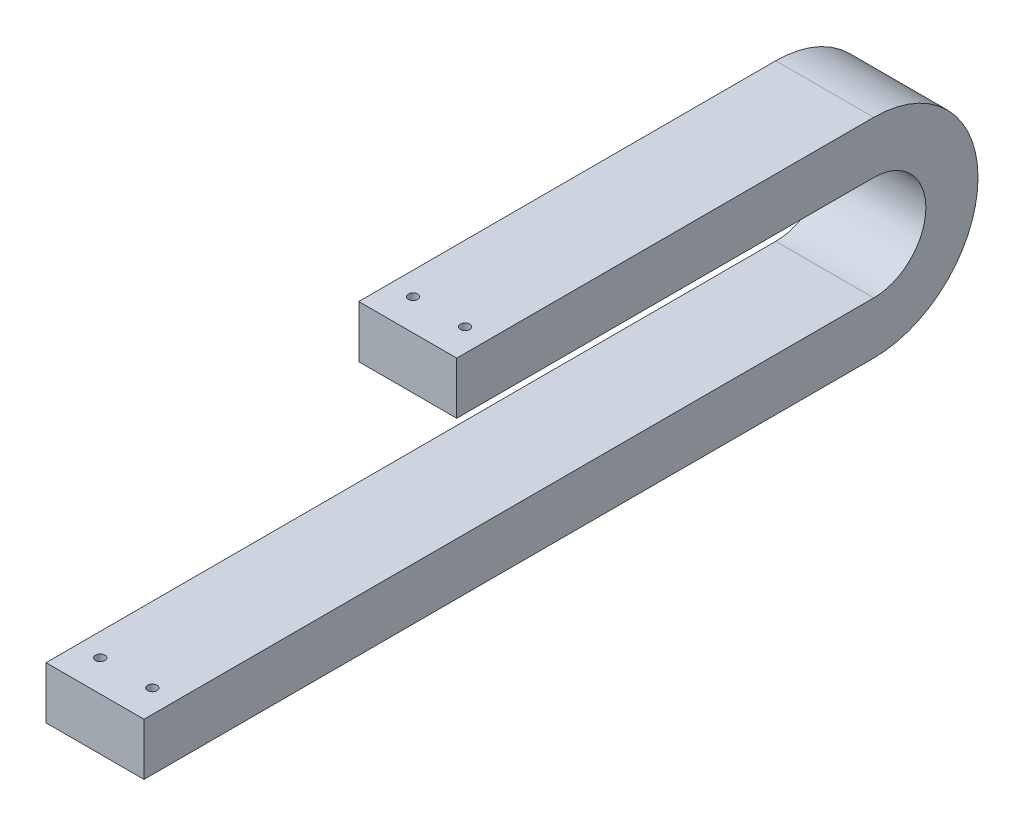
ISO-10303-21;
HEADER;
FILE_DESCRIPTION(('STEP AP214'),'2;1');
FILE_NAME('part.step','',(''),(''),'','','');
FILE_SCHEMA(('AUTOMOTIVE_DESIGN { 1 0 10303 214 1 1 1 1 }'));
ENDSEC;
DATA;
#1=APPLICATION_CONTEXT('core data for automotive mechanical design processes');
#2=APPLICATION_PROTOCOL_DEFINITION('international standard','automotive_design',2000,#1);
#3=PRODUCT_CONTEXT('',#1,'mechanical');
#4=PRODUCT('Part','Part','',(#3));
#5=PRODUCT_RELATED_PRODUCT_CATEGORY('part','',(#4));
#6=PRODUCT_DEFINITION_FORMATION('','',#4);
#7=PRODUCT_DEFINITION_CONTEXT('part definition',#1,'design');
#8=PRODUCT_DEFINITION('design','',#6,#7);
#9=PRODUCT_DEFINITION_SHAPE('','',#8);
#10=(LENGTH_UNIT() NAMED_UNIT(*) SI_UNIT(.MILLI.,.METRE.));
#11=(NAMED_UNIT(*) PLANE_ANGLE_UNIT() SI_UNIT($,.RADIAN.));
#12=(NAMED_UNIT(*) SI_UNIT($,.STERADIAN.) SOLID_ANGLE_UNIT());
#13=UNCERTAINTY_MEASURE_WITH_UNIT(LENGTH_MEASURE(1.E-05),#10,'distance_accuracy_value','');
#14=(GEOMETRIC_REPRESENTATION_CONTEXT(3) GLOBAL_UNCERTAINTY_ASSIGNED_CONTEXT((#13)) GLOBAL_UNIT_ASSIGNED_CONTEXT((#10,
#11,#12)) REPRESENTATION_CONTEXT('',''));
#15=CARTESIAN_POINT('',(0.,0.,0.));
#16=DIRECTION('',(0.,0.,1.));
#17=DIRECTION('',(1.,0.,0.));
#18=AXIS2_PLACEMENT_3D('',#15,#16,#17);
#19=CARTESIAN_POINT('',(47.,0.,0.));
#20=DIRECTION('',(0.,0.,-1.));
#21=DIRECTION('',(0.,1.,0.));
#22=AXIS2_PLACEMENT_3D('',#19,#20,#21);
#23=PLANE('',#22);
#24=DIRECTION('',(0.,-1.,0.));
#25=VECTOR('',#24,1.);
#26=CARTESIAN_POINT('',(0.,0.,0.));
#27=LINE('',#26,#25);
#28=CARTESIAN_POINT('',(0.,0.,0.));
#29=VERTEX_POINT('',#28);
#30=CARTESIAN_POINT('',(0.,-25.,0.));
#31=VERTEX_POINT('',#30);
#32=EDGE_CURVE('E132',#29,#31,#27,.T.);
#33=ORIENTED_EDGE('',*,*,#32,.T.);
#34=DIRECTION('',(-1.,0.,0.));
#35=VECTOR('',#34,1.);
#36=CARTESIAN_POINT('',(47.,-25.,0.));
#37=LINE('',#36,#35);
#38=CARTESIAN_POINT('',(47.,-25.,0.));
#39=VERTEX_POINT('',#38);
#40=EDGE_CURVE('E11',#39,#31,#37,.T.);
#41=ORIENTED_EDGE('',*,*,#40,.F.);
#42=DIRECTION('',(0.,-1.,0.));
#43=VECTOR('',#42,1.);
#44=CARTESIAN_POINT('',(47.,0.,0.));
#45=LINE('',#44,#43);
#46=CARTESIAN_POINT('',(47.,0.,0.));
#47=VERTEX_POINT('',#46);
#48=EDGE_CURVE('E147',#47,#39,#45,.T.);
#49=ORIENTED_EDGE('',*,*,#48,.F.);
#50=DIRECTION('',(-1.,0.,0.));
#51=VECTOR('',#50,1.);
#52=CARTESIAN_POINT('',(47.,0.,0.));
#53=LINE('',#52,#51);
#54=EDGE_CURVE('E128',#47,#29,#53,.T.);
#55=ORIENTED_EDGE('',*,*,#54,.T.);
#56=EDGE_LOOP('',(#33,#41,#49,#55));
#57=FACE_BOUND('',#56,.T.);
#58=ADVANCED_FACE('F34',(#57),#23,.F.);
#59=CARTESIAN_POINT('',(47.,-25.,0.));
#60=DIRECTION('',(0.,1.,0.));
#61=DIRECTION('',(0.,0.,1.));
#62=AXIS2_PLACEMENT_3D('',#59,#60,#61);
#63=PLANE('',#62);
#64=CARTESIAN_POINT('',(11.,-25.,-15.));
#65=DIRECTION('',(0.,1.,0.));
#66=DIRECTION('',(0.,0.,1.));
#67=AXIS2_PLACEMENT_3D('',#64,#65,#66);
#68=CIRCLE('',#67,2.25);
#69=CARTESIAN_POINT('',(11.,-25.,-12.75));
#70=VERTEX_POINT('',#69);
#71=EDGE_CURVE('E165',#70,#70,#68,.T.);
#72=ORIENTED_EDGE('',*,*,#71,.T.);
#73=EDGE_LOOP('',(#72));
#74=FACE_BOUND('',#73,.T.);
#75=CARTESIAN_POINT('',(36.,-25.,-15.));
#76=DIRECTION('',(0.,1.,0.));
#77=DIRECTION('',(0.,0.,1.));
#78=AXIS2_PLACEMENT_3D('',#75,#76,#77);
#79=CIRCLE('',#78,2.25);
#80=CARTESIAN_POINT('',(36.,-25.,-12.75));
#81=VERTEX_POINT('',#80);
#82=EDGE_CURVE('E136',#81,#81,#79,.T.);
#83=ORIENTED_EDGE('',*,*,#82,.T.);
#84=EDGE_LOOP('',(#83));
#85=FACE_BOUND('',#84,.T.);
#86=DIRECTION('',(0.,0.,-1.));
#87=VECTOR('',#86,1.);
#88=CARTESIAN_POINT('',(0.,-25.,0.));
#89=LINE('',#88,#87);
#90=CARTESIAN_POINT('',(0.,-25.,-350.));
#91=VERTEX_POINT('',#90);
#92=EDGE_CURVE('E135',#31,#91,#89,.T.);
#93=ORIENTED_EDGE('',*,*,#92,.T.);
#94=DIRECTION('',(-1.,0.,0.));
#95=VECTOR('',#94,1.);
#96=CARTESIAN_POINT('',(47.,-25.,-350.));
#97=LINE('',#96,#95);
#98=CARTESIAN_POINT('',(47.,-25.,-350.));
#99=VERTEX_POINT('',#98);
#100=EDGE_CURVE('E43',#99,#91,#97,.T.);
#101=ORIENTED_EDGE('',*,*,#100,.F.);
#102=DIRECTION('',(0.,0.,-1.));
#103=VECTOR('',#102,1.);
#104=CARTESIAN_POINT('',(47.,-25.,0.));
#105=LINE('',#104,#103);
#106=EDGE_CURVE('E95',#39,#99,#105,.T.);
#107=ORIENTED_EDGE('',*,*,#106,.F.);
#108=ORIENTED_EDGE('',*,*,#40,.T.);
#109=EDGE_LOOP('',(#93,#101,#107,#108));
#110=FACE_BOUND('',#109,.T.);
#111=ADVANCED_FACE('F218',(#74,#85,#110),#63,.F.);
#112=CARTESIAN_POINT('',(47.,25.,-350.));
#113=DIRECTION('',(-1.,0.,0.));
#114=DIRECTION('',(0.,0.,1.));
#115=AXIS2_PLACEMENT_3D('',#112,#113,#114);
#116=CYLINDRICAL_SURFACE('',#115,50.);
#117=CARTESIAN_POINT('',(0.,25.,-350.));
#118=DIRECTION('',(1.,0.,0.));
#119=DIRECTION('',(0.,0.,-1.));
#120=AXIS2_PLACEMENT_3D('',#117,#118,#119);
#121=CIRCLE('',#120,50.);
#122=CARTESIAN_POINT('',(0.,75.,-350.));
#123=VERTEX_POINT('',#122);
#124=EDGE_CURVE('E138',#91,#123,#121,.T.);
#125=ORIENTED_EDGE('',*,*,#124,.T.);
#126=DIRECTION('',(-1.,0.,0.));
#127=VECTOR('',#126,1.);
#128=CARTESIAN_POINT('',(47.,75.,-350.));
#129=LINE('',#128,#127);
#130=CARTESIAN_POINT('',(47.,75.,-350.));
#131=VERTEX_POINT('',#130);
#132=EDGE_CURVE('E154',#131,#123,#129,.T.);
#133=ORIENTED_EDGE('',*,*,#132,.F.);
#134=CARTESIAN_POINT('',(47.,25.,-350.));
#135=DIRECTION('',(1.,0.,0.));
#136=DIRECTION('',(0.,0.,-1.));
#137=AXIS2_PLACEMENT_3D('',#134,#135,#136);
#138=CIRCLE('',#137,50.);
#139=EDGE_CURVE('E184',#99,#131,#138,.T.);
#140=ORIENTED_EDGE('',*,*,#139,.F.);
#141=ORIENTED_EDGE('',*,*,#100,.T.);
#142=EDGE_LOOP('',(#125,#133,#140,#141));
#143=FACE_BOUND('',#142,.T.);
#144=ADVANCED_FACE('F222',(#143),#116,.T.);
#145=CARTESIAN_POINT('',(47.,75.,-350.));
#146=DIRECTION('',(0.,-1.,0.));
#147=DIRECTION('',(0.,0.,-1.));
#148=AXIS2_PLACEMENT_3D('',#145,#146,#147);
#149=PLANE('',#148);
#150=CARTESIAN_POINT('',(36.,75.,-165.));
#151=DIRECTION('',(0.,1.,0.));
#152=DIRECTION('',(0.,0.,1.));
#153=AXIS2_PLACEMENT_3D('',#150,#151,#152);
#154=CIRCLE('',#153,2.25);
#155=CARTESIAN_POINT('',(36.,75.,-162.75));
#156=VERTEX_POINT('',#155);
#157=EDGE_CURVE('E172',#156,#156,#154,.T.);
#158=ORIENTED_EDGE('',*,*,#157,.F.);
#159=EDGE_LOOP('',(#158));
#160=FACE_BOUND('',#159,.T.);
#161=CARTESIAN_POINT('',(11.,75.,-165.));
#162=DIRECTION('',(0.,1.,0.));
#163=DIRECTION('',(0.,0.,1.));
#164=AXIS2_PLACEMENT_3D('',#161,#162,#163);
#165=CIRCLE('',#164,2.25);
#166=CARTESIAN_POINT('',(11.,75.,-162.75));
#167=VERTEX_POINT('',#166);
#168=EDGE_CURVE('E161',#167,#167,#165,.T.);
#169=ORIENTED_EDGE('',*,*,#168,.F.);
#170=EDGE_LOOP('',(#169));
#171=FACE_BOUND('',#170,.T.);
#172=DIRECTION('',(0.,0.,1.));
#173=VECTOR('',#172,1.);
#174=CARTESIAN_POINT('',(0.,75.,-350.));
#175=LINE('',#174,#173);
#176=CARTESIAN_POINT('',(0.,75.,-150.));
#177=VERTEX_POINT('',#176);
#178=EDGE_CURVE('E140',#123,#177,#175,.T.);
#179=ORIENTED_EDGE('',*,*,#178,.T.);
#180=DIRECTION('',(-1.,0.,0.));
#181=VECTOR('',#180,1.);
#182=CARTESIAN_POINT('',(47.,75.,-150.));
#183=LINE('',#182,#181);
#184=CARTESIAN_POINT('',(47.,75.,-150.));
#185=VERTEX_POINT('',#184);
#186=EDGE_CURVE('E151',#185,#177,#183,.T.);
#187=ORIENTED_EDGE('',*,*,#186,.F.);
#188=DIRECTION('',(0.,0.,1.));
#189=VECTOR('',#188,1.);
#190=CARTESIAN_POINT('',(47.,75.,-350.));
#191=LINE('',#190,#189);
#192=EDGE_CURVE('E186',#131,#185,#191,.T.);
#193=ORIENTED_EDGE('',*,*,#192,.F.);
#194=ORIENTED_EDGE('',*,*,#132,.T.);
#195=EDGE_LOOP('',(#179,#187,#193,#194));
#196=FACE_BOUND('',#195,.T.);
#197=ADVANCED_FACE('F192',(#160,#171,#196),#149,.F.);
#198=CARTESIAN_POINT('',(47.,75.,-150.));
#199=DIRECTION('',(0.,0.,-1.));
#200=DIRECTION('',(-1.,0.,0.));
#201=AXIS2_PLACEMENT_3D('',#198,#199,#200);
#202=PLANE('',#201);
#203=DIRECTION('',(0.,-1.,0.));
#204=VECTOR('',#203,1.);
#205=CARTESIAN_POINT('',(0.,75.,-150.));
#206=LINE('',#205,#204);
#207=CARTESIAN_POINT('',(0.,50.,-150.));
#208=VERTEX_POINT('',#207);
#209=EDGE_CURVE('E142',#177,#208,#206,.T.);
#210=ORIENTED_EDGE('',*,*,#209,.T.);
#211=DIRECTION('',(-1.,0.,0.));
#212=VECTOR('',#211,1.);
#213=CARTESIAN_POINT('',(47.,50.,-150.));
#214=LINE('',#213,#212);
#215=CARTESIAN_POINT('',(47.,50.,-150.));
#216=VERTEX_POINT('',#215);
#217=EDGE_CURVE('E123',#216,#208,#214,.T.);
#218=ORIENTED_EDGE('',*,*,#217,.F.);
#219=DIRECTION('',(0.,-1.,0.));
#220=VECTOR('',#219,1.);
#221=CARTESIAN_POINT('',(47.,75.,-150.));
#222=LINE('',#221,#220);
#223=EDGE_CURVE('E114',#185,#216,#222,.T.);
#224=ORIENTED_EDGE('',*,*,#223,.F.);
#225=ORIENTED_EDGE('',*,*,#186,.T.);
#226=EDGE_LOOP('',(#210,#218,#224,#225));
#227=FACE_BOUND('',#226,.T.);
#228=ADVANCED_FACE('F196',(#227),#202,.F.);
#229=CARTESIAN_POINT('',(47.,50.,-350.));
#230=DIRECTION('',(0.,1.,0.));
#231=DIRECTION('',(0.,0.,1.));
#232=AXIS2_PLACEMENT_3D('',#229,#230,#231);
#233=PLANE('',#232);
#234=CARTESIAN_POINT('',(36.,50.,-165.));
#235=DIRECTION('',(0.,1.,0.));
#236=DIRECTION('',(0.,0.,1.));
#237=AXIS2_PLACEMENT_3D('',#234,#235,#236);
#238=CIRCLE('',#237,2.25);
#239=CARTESIAN_POINT('',(36.,50.,-162.75));
#240=VERTEX_POINT('',#239);
#241=EDGE_CURVE('E37',#240,#240,#238,.T.);
#242=ORIENTED_EDGE('',*,*,#241,.T.);
#243=EDGE_LOOP('',(#242));
#244=FACE_BOUND('',#243,.T.);
#245=CARTESIAN_POINT('',(11.,50.,-165.));
#246=DIRECTION('',(0.,1.,0.));
#247=DIRECTION('',(0.,0.,1.));
#248=AXIS2_PLACEMENT_3D('',#245,#246,#247);
#249=CIRCLE('',#248,2.25);
#250=CARTESIAN_POINT('',(11.,50.,-162.75));
#251=VERTEX_POINT('',#250);
#252=EDGE_CURVE('E158',#251,#251,#249,.T.);
#253=ORIENTED_EDGE('',*,*,#252,.T.);
#254=EDGE_LOOP('',(#253));
#255=FACE_BOUND('',#254,.T.);
#256=DIRECTION('',(0.,0.,-1.));
#257=VECTOR('',#256,1.);
#258=CARTESIAN_POINT('',(0.,50.,-350.));
#259=LINE('',#258,#257);
#260=CARTESIAN_POINT('',(0.,50.,-350.));
#261=VERTEX_POINT('',#260);
#262=EDGE_CURVE('E122',#208,#261,#259,.T.);
#263=ORIENTED_EDGE('',*,*,#262,.T.);
#264=DIRECTION('',(-1.,0.,0.));
#265=VECTOR('',#264,1.);
#266=CARTESIAN_POINT('',(47.,50.,-350.));
#267=LINE('',#266,#265);
#268=CARTESIAN_POINT('',(47.,50.,-350.));
#269=VERTEX_POINT('',#268);
#270=EDGE_CURVE('E119',#269,#261,#267,.T.);
#271=ORIENTED_EDGE('',*,*,#270,.F.);
#272=DIRECTION('',(0.,0.,-1.));
#273=VECTOR('',#272,1.);
#274=CARTESIAN_POINT('',(47.,50.,-350.));
#275=LINE('',#274,#273);
#276=EDGE_CURVE('E108',#216,#269,#275,.T.);
#277=ORIENTED_EDGE('',*,*,#276,.F.);
#278=ORIENTED_EDGE('',*,*,#217,.T.);
#279=EDGE_LOOP('',(#263,#271,#277,#278));
#280=FACE_BOUND('',#279,.T.);
#281=ADVANCED_FACE('F120',(#244,#255,#280),#233,.F.);
#282=CARTESIAN_POINT('',(47.,25.,-350.));
#283=DIRECTION('',(-1.,0.,0.));
#284=DIRECTION('',(0.,0.,1.));
#285=AXIS2_PLACEMENT_3D('',#282,#283,#284);
#286=CYLINDRICAL_SURFACE('',#285,25.);
#287=CARTESIAN_POINT('',(0.,25.,-350.));
#288=DIRECTION('',(-1.,0.,0.));
#289=DIRECTION('',(0.,0.,-1.));
#290=AXIS2_PLACEMENT_3D('',#287,#288,#289);
#291=CIRCLE('',#290,25.);
#292=CARTESIAN_POINT('',(0.,0.,-350.));
#293=VERTEX_POINT('',#292);
#294=EDGE_CURVE('E81',#261,#293,#291,.T.);
#295=ORIENTED_EDGE('',*,*,#294,.T.);
#296=DIRECTION('',(-1.,0.,0.));
#297=VECTOR('',#296,1.);
#298=CARTESIAN_POINT('',(47.,0.,-350.));
#299=LINE('',#298,#297);
#300=CARTESIAN_POINT('',(47.,0.,-350.));
#301=VERTEX_POINT('',#300);
#302=EDGE_CURVE('E124',#301,#293,#299,.T.);
#303=ORIENTED_EDGE('',*,*,#302,.F.);
#304=CARTESIAN_POINT('',(47.,25.,-350.));
#305=DIRECTION('',(-1.,0.,0.));
#306=DIRECTION('',(0.,0.,-1.));
#307=AXIS2_PLACEMENT_3D('',#304,#305,#306);
#308=CIRCLE('',#307,25.);
#309=EDGE_CURVE('E112',#269,#301,#308,.T.);
#310=ORIENTED_EDGE('',*,*,#309,.F.);
#311=ORIENTED_EDGE('',*,*,#270,.T.);
#312=EDGE_LOOP('',(#295,#303,#310,#311));
#313=FACE_BOUND('',#312,.T.);
#314=ADVANCED_FACE('F126',(#313),#286,.F.);
#315=CARTESIAN_POINT('',(47.,0.,0.));
#316=DIRECTION('',(0.,-1.,0.));
#317=DIRECTION('',(0.,0.,-1.));
#318=AXIS2_PLACEMENT_3D('',#315,#316,#317);
#319=PLANE('',#318);
#320=CARTESIAN_POINT('',(11.,0.,-15.));
#321=DIRECTION('',(0.,1.,0.));
#322=DIRECTION('',(0.,0.,1.));
#323=AXIS2_PLACEMENT_3D('',#320,#321,#322);
#324=CIRCLE('',#323,2.25);
#325=CARTESIAN_POINT('',(11.,0.,-12.75));
#326=VERTEX_POINT('',#325);
#327=EDGE_CURVE('E160',#326,#326,#324,.T.);
#328=ORIENTED_EDGE('',*,*,#327,.F.);
#329=EDGE_LOOP('',(#328));
#330=FACE_BOUND('',#329,.T.);
#331=CARTESIAN_POINT('',(36.,0.,-15.));
#332=DIRECTION('',(0.,1.,0.));
#333=DIRECTION('',(0.,0.,1.));
#334=AXIS2_PLACEMENT_3D('',#331,#332,#333);
#335=CIRCLE('',#334,2.25);
#336=CARTESIAN_POINT('',(36.,0.,-12.75));
#337=VERTEX_POINT('',#336);
#338=EDGE_CURVE('E177',#337,#337,#335,.T.);
#339=ORIENTED_EDGE('',*,*,#338,.F.);
#340=EDGE_LOOP('',(#339));
#341=FACE_BOUND('',#340,.T.);
#342=DIRECTION('',(0.,0.,1.));
#343=VECTOR('',#342,1.);
#344=CARTESIAN_POINT('',(0.,0.,0.));
#345=LINE('',#344,#343);
#346=EDGE_CURVE('E87',#293,#29,#345,.T.);
#347=ORIENTED_EDGE('',*,*,#346,.T.);
#348=ORIENTED_EDGE('',*,*,#54,.F.);
#349=DIRECTION('',(0.,0.,1.));
#350=VECTOR('',#349,1.);
#351=CARTESIAN_POINT('',(47.,0.,0.));
#352=LINE('',#351,#350);
#353=EDGE_CURVE('E52',#301,#47,#352,.T.);
#354=ORIENTED_EDGE('',*,*,#353,.F.);
#355=ORIENTED_EDGE('',*,*,#302,.T.);
#356=EDGE_LOOP('',(#347,#348,#354,#355));
#357=FACE_BOUND('',#356,.T.);
#358=ADVANCED_FACE('F204',(#330,#341,#357),#319,.F.);
#359=CARTESIAN_POINT('',(47.,25.,-350.));
#360=DIRECTION('',(1.,0.,0.));
#361=DIRECTION('',(0.,0.,-1.));
#362=AXIS2_PLACEMENT_3D('',#359,#360,#361);
#363=PLANE('',#362);
#364=ORIENTED_EDGE('',*,*,#48,.T.);
#365=ORIENTED_EDGE('',*,*,#106,.T.);
#366=ORIENTED_EDGE('',*,*,#139,.T.);
#367=ORIENTED_EDGE('',*,*,#192,.T.);
#368=ORIENTED_EDGE('',*,*,#223,.T.);
#369=ORIENTED_EDGE('',*,*,#276,.T.);
#370=ORIENTED_EDGE('',*,*,#309,.T.);
#371=ORIENTED_EDGE('',*,*,#353,.T.);
#372=EDGE_LOOP('',(#364,#365,#366,#367,#368,#369,#370,#371));
#373=FACE_BOUND('',#372,.T.);
#374=ADVANCED_FACE('F110',(#373),#363,.T.);
#375=CARTESIAN_POINT('',(0.,25.,-350.));
#376=DIRECTION('',(1.,0.,0.));
#377=DIRECTION('',(0.,0.,-1.));
#378=AXIS2_PLACEMENT_3D('',#375,#376,#377);
#379=PLANE('',#378);
#380=ORIENTED_EDGE('',*,*,#32,.F.);
#381=ORIENTED_EDGE('',*,*,#346,.F.);
#382=ORIENTED_EDGE('',*,*,#294,.F.);
#383=ORIENTED_EDGE('',*,*,#262,.F.);
#384=ORIENTED_EDGE('',*,*,#209,.F.);
#385=ORIENTED_EDGE('',*,*,#178,.F.);
#386=ORIENTED_EDGE('',*,*,#124,.F.);
#387=ORIENTED_EDGE('',*,*,#92,.F.);
#388=EDGE_LOOP('',(#380,#381,#382,#383,#384,#385,#386,#387));
#389=FACE_BOUND('',#388,.T.);
#390=ADVANCED_FACE('F199',(#389),#379,.F.);
#391=CARTESIAN_POINT('',(36.,-90.,-15.));
#392=DIRECTION('',(0.,1.,0.));
#393=DIRECTION('',(0.,0.,1.));
#394=AXIS2_PLACEMENT_3D('',#391,#392,#393);
#395=CYLINDRICAL_SURFACE('',#394,2.25);
#396=CARTESIAN_POINT('',(36.,0.,-12.75));
#397=CARTESIAN_POINT('',(36.,-0.260416666666679,-12.75));
#398=CARTESIAN_POINT('',(36.,-0.520833333333345,-12.75));
#399=CARTESIAN_POINT('',(36.,-1.04166666666668,-12.75));
#400=CARTESIAN_POINT('',(36.,-1.30208333333334,-12.75));
#401=CARTESIAN_POINT('',(36.,-1.82291666666668,-12.75));
#402=CARTESIAN_POINT('',(36.,-2.08333333333335,-12.75));
#403=CARTESIAN_POINT('',(36.,-2.60416666666669,-12.75));
#404=CARTESIAN_POINT('',(36.,-2.86458333333335,-12.75));
#405=CARTESIAN_POINT('',(36.,-3.38541666666668,-12.75));
#406=CARTESIAN_POINT('',(36.,-3.64583333333335,-12.75));
#407=CARTESIAN_POINT('',(36.,-4.16666666666668,-12.75));
#408=CARTESIAN_POINT('',(36.,-4.42708333333335,-12.75));
#409=CARTESIAN_POINT('',(36.,-4.94791666666668,-12.75));
#410=CARTESIAN_POINT('',(36.,-5.20833333333334,-12.75));
#411=CARTESIAN_POINT('',(36.,-5.72916666666668,-12.75));
#412=CARTESIAN_POINT('',(36.,-5.98958333333335,-12.75));
#413=CARTESIAN_POINT('',(36.,-6.51041666666669,-12.75));
#414=CARTESIAN_POINT('',(36.,-6.77083333333335,-12.75));
#415=CARTESIAN_POINT('',(36.,-7.29166666666668,-12.75));
#416=CARTESIAN_POINT('',(36.,-7.55208333333335,-12.75));
#417=CARTESIAN_POINT('',(36.,-8.07291666666668,-12.75));
#418=CARTESIAN_POINT('',(36.,-8.33333333333334,-12.75));
#419=CARTESIAN_POINT('',(36.,-8.85416666666668,-12.75));
#420=CARTESIAN_POINT('',(36.,-9.11458333333334,-12.75));
#421=CARTESIAN_POINT('',(36.,-9.63541666666668,-12.75));
#422=CARTESIAN_POINT('',(36.,-9.89583333333335,-12.75));
#423=CARTESIAN_POINT('',(36.,-10.4166666666667,-12.75));
#424=CARTESIAN_POINT('',(36.,-10.6770833333334,-12.75));
#425=CARTESIAN_POINT('',(36.,-11.1979166666667,-12.75));
#426=CARTESIAN_POINT('',(36.,-11.4583333333333,-12.75));
#427=CARTESIAN_POINT('',(36.,-11.9791666666667,-12.75));
#428=CARTESIAN_POINT('',(36.,-12.2395833333333,-12.75));
#429=CARTESIAN_POINT('',(36.,-12.7604166666667,-12.75));
#430=CARTESIAN_POINT('',(36.,-13.0208333333333,-12.75));
#431=CARTESIAN_POINT('',(36.,-13.5416666666667,-12.75));
#432=CARTESIAN_POINT('',(36.,-13.8020833333333,-12.75));
#433=CARTESIAN_POINT('',(36.,-14.3229166666667,-12.75));
#434=CARTESIAN_POINT('',(36.,-14.5833333333333,-12.75));
#435=CARTESIAN_POINT('',(36.,-15.1041666666667,-12.75));
#436=CARTESIAN_POINT('',(36.,-15.3645833333333,-12.75));
#437=CARTESIAN_POINT('',(36.,-15.8854166666667,-12.75));
#438=CARTESIAN_POINT('',(36.,-16.1458333333333,-12.75));
#439=CARTESIAN_POINT('',(36.,-16.6666666666667,-12.75));
#440=CARTESIAN_POINT('',(36.,-16.9270833333333,-12.75));
#441=CARTESIAN_POINT('',(36.,-17.4479166666667,-12.75));
#442=CARTESIAN_POINT('',(36.,-17.7083333333333,-12.75));
#443=CARTESIAN_POINT('',(36.,-18.2291666666667,-12.75));
#444=CARTESIAN_POINT('',(36.,-18.4895833333333,-12.75));
#445=CARTESIAN_POINT('',(36.,-19.0104166666667,-12.75));
#446=CARTESIAN_POINT('',(36.,-19.2708333333333,-12.75));
#447=CARTESIAN_POINT('',(36.,-19.7916666666667,-12.75));
#448=CARTESIAN_POINT('',(36.,-20.0520833333333,-12.75));
#449=CARTESIAN_POINT('',(36.,-20.5729166666667,-12.75));
#450=CARTESIAN_POINT('',(36.,-20.8333333333333,-12.75));
#451=CARTESIAN_POINT('',(36.,-21.3541666666667,-12.75));
#452=CARTESIAN_POINT('',(36.,-21.6145833333333,-12.75));
#453=CARTESIAN_POINT('',(36.,-22.1354166666667,-12.75));
#454=CARTESIAN_POINT('',(36.,-22.3958333333333,-12.75));
#455=CARTESIAN_POINT('',(36.,-22.9166666666667,-12.75));
#456=CARTESIAN_POINT('',(36.,-23.1770833333333,-12.75));
#457=CARTESIAN_POINT('',(36.,-23.6979166666667,-12.75));
#458=CARTESIAN_POINT('',(36.,-23.9583333333333,-12.75));
#459=CARTESIAN_POINT('',(36.,-24.4791666666667,-12.75));
#460=CARTESIAN_POINT('',(36.,-24.7395833333333,-12.75));
#461=CARTESIAN_POINT('',(36.,-25.,-12.75));
#462=B_SPLINE_CURVE_WITH_KNOTS('',3,(#396,#397,#398,#399,#400,#401,#402,#403,#404,#405,#406,
#407,#408,#409,#410,#411,#412,#413,#414,#415,#416,#417,#418,#419,#420,#421,#422,#423,#424,#425,
#426,#427,#428,#429,#430,#431,#432,#433,#434,#435,#436,#437,#438,#439,#440,#441,#442,#443,#444,
#445,#446,#447,#448,#449,#450,#451,#452,#453,#454,#455,#456,#457,#458,#459,#460,#461),
.UNSPECIFIED.,.F.,.F.,(4,2,2,2,2,2,2,2,2,2,2,2,2,2,2,2,2,2,2,2,2,2,2,2,2,2,2,2,2,2,2,2,4),(0.,
0.781249999999997,1.56249999999999,2.34375000000001,3.125,3.90625,4.6875,5.46874999999999,
6.25000000000001,7.03125,7.8125,8.59375,9.37499999999999,10.15625,10.9375,11.71875,12.5,
13.28125,14.0625,14.84375,15.625,16.40625,17.1875,17.96875,18.75,19.53125,20.3125,21.09375,
21.875,22.65625,23.4375,24.21875,25.),.UNSPECIFIED.);
#463=EDGE_CURVE('BSEAM256',#337,#81,#462,.T.);
#464=ORIENTED_EDGE('',*,*,#338,.T.);
#465=ORIENTED_EDGE('',*,*,#82,.F.);
#466=ORIENTED_EDGE('',*,*,#463,.T.);
#467=ORIENTED_EDGE('',*,*,#463,.F.);
#468=EDGE_LOOP('',(#464,#466,#465,#467));
#469=FACE_BOUND('',#468,.T.);
#470=ADVANCED_FACE('F256',(#469),#395,.F.);
#471=CARTESIAN_POINT('',(11.,-90.,-15.));
#472=DIRECTION('',(0.,1.,0.));
#473=DIRECTION('',(0.,0.,1.));
#474=AXIS2_PLACEMENT_3D('',#471,#472,#473);
#475=CYLINDRICAL_SURFACE('',#474,2.25);
#476=CARTESIAN_POINT('',(11.,0.,-12.75));
#477=CARTESIAN_POINT('',(11.,-0.260416666666679,-12.75));
#478=CARTESIAN_POINT('',(11.,-0.520833333333345,-12.75));
#479=CARTESIAN_POINT('',(11.,-1.04166666666668,-12.75));
#480=CARTESIAN_POINT('',(11.,-1.30208333333334,-12.75));
#481=CARTESIAN_POINT('',(11.,-1.82291666666668,-12.75));
#482=CARTESIAN_POINT('',(11.,-2.08333333333335,-12.75));
#483=CARTESIAN_POINT('',(11.,-2.60416666666669,-12.75));
#484=CARTESIAN_POINT('',(11.,-2.86458333333335,-12.75));
#485=CARTESIAN_POINT('',(11.,-3.38541666666668,-12.75));
#486=CARTESIAN_POINT('',(11.,-3.64583333333335,-12.75));
#487=CARTESIAN_POINT('',(11.,-4.16666666666668,-12.75));
#488=CARTESIAN_POINT('',(11.,-4.42708333333335,-12.75));
#489=CARTESIAN_POINT('',(11.,-4.94791666666668,-12.75));
#490=CARTESIAN_POINT('',(11.,-5.20833333333334,-12.75));
#491=CARTESIAN_POINT('',(11.,-5.72916666666668,-12.75));
#492=CARTESIAN_POINT('',(11.,-5.98958333333335,-12.75));
#493=CARTESIAN_POINT('',(11.,-6.51041666666669,-12.75));
#494=CARTESIAN_POINT('',(11.,-6.77083333333335,-12.75));
#495=CARTESIAN_POINT('',(11.,-7.29166666666668,-12.75));
#496=CARTESIAN_POINT('',(11.,-7.55208333333335,-12.75));
#497=CARTESIAN_POINT('',(11.,-8.07291666666668,-12.75));
#498=CARTESIAN_POINT('',(11.,-8.33333333333334,-12.75));
#499=CARTESIAN_POINT('',(11.,-8.85416666666668,-12.75));
#500=CARTESIAN_POINT('',(11.,-9.11458333333334,-12.75));
#501=CARTESIAN_POINT('',(11.,-9.63541666666668,-12.75));
#502=CARTESIAN_POINT('',(11.,-9.89583333333335,-12.75));
#503=CARTESIAN_POINT('',(11.,-10.4166666666667,-12.75));
#504=CARTESIAN_POINT('',(11.,-10.6770833333334,-12.75));
#505=CARTESIAN_POINT('',(11.,-11.1979166666667,-12.75));
#506=CARTESIAN_POINT('',(11.,-11.4583333333333,-12.75));
#507=CARTESIAN_POINT('',(11.,-11.9791666666667,-12.75));
#508=CARTESIAN_POINT('',(11.,-12.2395833333333,-12.75));
#509=CARTESIAN_POINT('',(11.,-12.7604166666667,-12.75));
#510=CARTESIAN_POINT('',(11.,-13.0208333333333,-12.75));
#511=CARTESIAN_POINT('',(11.,-13.5416666666667,-12.75));
#512=CARTESIAN_POINT('',(11.,-13.8020833333333,-12.75));
#513=CARTESIAN_POINT('',(11.,-14.3229166666667,-12.75));
#514=CARTESIAN_POINT('',(11.,-14.5833333333333,-12.75));
#515=CARTESIAN_POINT('',(11.,-15.1041666666667,-12.75));
#516=CARTESIAN_POINT('',(11.,-15.3645833333333,-12.75));
#517=CARTESIAN_POINT('',(11.,-15.8854166666667,-12.75));
#518=CARTESIAN_POINT('',(11.,-16.1458333333333,-12.75));
#519=CARTESIAN_POINT('',(11.,-16.6666666666667,-12.75));
#520=CARTESIAN_POINT('',(11.,-16.9270833333333,-12.75));
#521=CARTESIAN_POINT('',(11.,-17.4479166666667,-12.75));
#522=CARTESIAN_POINT('',(11.,-17.7083333333333,-12.75));
#523=CARTESIAN_POINT('',(11.,-18.2291666666667,-12.75));
#524=CARTESIAN_POINT('',(11.,-18.4895833333333,-12.75));
#525=CARTESIAN_POINT('',(11.,-19.0104166666667,-12.75));
#526=CARTESIAN_POINT('',(11.,-19.2708333333333,-12.75));
#527=CARTESIAN_POINT('',(11.,-19.7916666666667,-12.75));
#528=CARTESIAN_POINT('',(11.,-20.0520833333333,-12.75));
#529=CARTESIAN_POINT('',(11.,-20.5729166666667,-12.75));
#530=CARTESIAN_POINT('',(11.,-20.8333333333333,-12.75));
#531=CARTESIAN_POINT('',(11.,-21.3541666666667,-12.75));
#532=CARTESIAN_POINT('',(11.,-21.6145833333333,-12.75));
#533=CARTESIAN_POINT('',(11.,-22.1354166666667,-12.75));
#534=CARTESIAN_POINT('',(11.,-22.3958333333333,-12.75));
#535=CARTESIAN_POINT('',(11.,-22.9166666666667,-12.75));
#536=CARTESIAN_POINT('',(11.,-23.1770833333333,-12.75));
#537=CARTESIAN_POINT('',(11.,-23.6979166666667,-12.75));
#538=CARTESIAN_POINT('',(11.,-23.9583333333333,-12.75));
#539=CARTESIAN_POINT('',(11.,-24.4791666666667,-12.75));
#540=CARTESIAN_POINT('',(11.,-24.7395833333333,-12.75));
#541=CARTESIAN_POINT('',(11.,-25.,-12.75));
#542=B_SPLINE_CURVE_WITH_KNOTS('',3,(#476,#477,#478,#479,#480,#481,#482,#483,#484,#485,#486,
#487,#488,#489,#490,#491,#492,#493,#494,#495,#496,#497,#498,#499,#500,#501,#502,#503,#504,#505,
#506,#507,#508,#509,#510,#511,#512,#513,#514,#515,#516,#517,#518,#519,#520,#521,#522,#523,#524,
#525,#526,#527,#528,#529,#530,#531,#532,#533,#534,#535,#536,#537,#538,#539,#540,#541),
.UNSPECIFIED.,.F.,.F.,(4,2,2,2,2,2,2,2,2,2,2,2,2,2,2,2,2,2,2,2,2,2,2,2,2,2,2,2,2,2,2,2,4),(0.,
0.781249999999997,1.56249999999999,2.34375000000001,3.125,3.90625,4.6875,5.46874999999999,
6.25000000000001,7.03125,7.8125,8.59375,9.37499999999999,10.15625,10.9375,11.71875,12.5,
13.28125,14.0625,14.84375,15.625,16.40625,17.1875,17.96875,18.75,19.53125,20.3125,21.09375,
21.875,22.65625,23.4375,24.21875,25.),.UNSPECIFIED.);
#543=EDGE_CURVE('BSEAM250',#326,#70,#542,.T.);
#544=ORIENTED_EDGE('',*,*,#327,.T.);
#545=ORIENTED_EDGE('',*,*,#71,.F.);
#546=ORIENTED_EDGE('',*,*,#543,.T.);
#547=ORIENTED_EDGE('',*,*,#543,.F.);
#548=EDGE_LOOP('',(#544,#546,#545,#547));
#549=FACE_BOUND('',#548,.T.);
#550=ADVANCED_FACE('F250',(#549),#475,.F.);
#551=CARTESIAN_POINT('',(11.,35.,-165.));
#552=DIRECTION('',(0.,1.,0.));
#553=DIRECTION('',(0.,0.,1.));
#554=AXIS2_PLACEMENT_3D('',#551,#552,#553);
#555=CYLINDRICAL_SURFACE('',#554,2.25);
#556=ORIENTED_EDGE('',*,*,#168,.T.);
#557=EDGE_LOOP('',(#556));
#558=FACE_BOUND('',#557,.T.);
#559=ORIENTED_EDGE('',*,*,#252,.F.);
#560=EDGE_LOOP('',(#559));
#561=FACE_BOUND('',#560,.T.);
#562=ADVANCED_FACE('F244',(#558,#561),#555,.F.);
#563=CARTESIAN_POINT('',(36.,35.,-165.));
#564=DIRECTION('',(0.,1.,0.));
#565=DIRECTION('',(0.,0.,1.));
#566=AXIS2_PLACEMENT_3D('',#563,#564,#565);
#567=CYLINDRICAL_SURFACE('',#566,2.25);
#568=ORIENTED_EDGE('',*,*,#157,.T.);
#569=EDGE_LOOP('',(#568));
#570=FACE_BOUND('',#569,.T.);
#571=ORIENTED_EDGE('',*,*,#241,.F.);
#572=EDGE_LOOP('',(#571));
#573=FACE_BOUND('',#572,.T.);
#574=ADVANCED_FACE('F242',(#570,#573),#567,.F.);
#575=CLOSED_SHELL('',(#58,#111,#144,#197,#228,#281,#314,#358,#374,#390,#470,#550,#562,#574));
#576=MANIFOLD_SOLID_BREP('B2',#575);
#577=ADVANCED_BREP_SHAPE_REPRESENTATION('',(#18,#576),#14);
#578=SHAPE_DEFINITION_REPRESENTATION(#9,#577);
ENDSEC;
END-ISO-10303-21;
